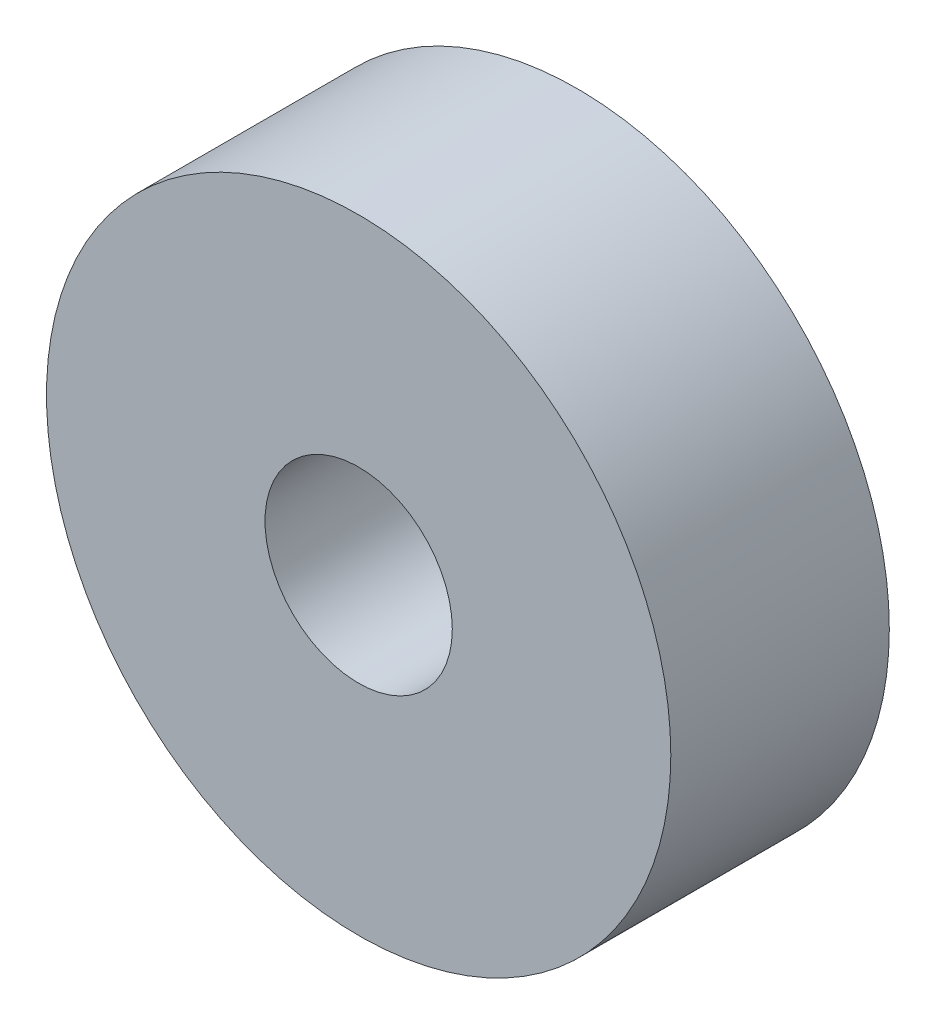
ISO-10303-21;
HEADER;
FILE_DESCRIPTION(('STEP AP214'),'2;1');
FILE_NAME('part.step','',(''),(''),'','','');
FILE_SCHEMA(('AUTOMOTIVE_DESIGN { 1 0 10303 214 1 1 1 1 }'));
ENDSEC;
DATA;
#1=APPLICATION_CONTEXT('core data for automotive mechanical design processes');
#2=APPLICATION_PROTOCOL_DEFINITION('international standard','automotive_design',2000,#1);
#3=PRODUCT_CONTEXT('',#1,'mechanical');
#4=PRODUCT('Part','Part','',(#3));
#5=PRODUCT_RELATED_PRODUCT_CATEGORY('part','',(#4));
#6=PRODUCT_DEFINITION_FORMATION('','',#4);
#7=PRODUCT_DEFINITION_CONTEXT('part definition',#1,'design');
#8=PRODUCT_DEFINITION('design','',#6,#7);
#9=PRODUCT_DEFINITION_SHAPE('','',#8);
#10=(LENGTH_UNIT() NAMED_UNIT(*) SI_UNIT(.MILLI.,.METRE.));
#11=(NAMED_UNIT(*) PLANE_ANGLE_UNIT() SI_UNIT($,.RADIAN.));
#12=(NAMED_UNIT(*) SI_UNIT($,.STERADIAN.) SOLID_ANGLE_UNIT());
#13=UNCERTAINTY_MEASURE_WITH_UNIT(LENGTH_MEASURE(1.E-05),#10,'distance_accuracy_value','');
#14=(GEOMETRIC_REPRESENTATION_CONTEXT(3) GLOBAL_UNCERTAINTY_ASSIGNED_CONTEXT((#13)) GLOBAL_UNIT_ASSIGNED_CONTEXT((#10,
#11,#12)) REPRESENTATION_CONTEXT('',''));
#15=CARTESIAN_POINT('',(0.,0.,0.));
#16=DIRECTION('',(0.,0.,1.));
#17=DIRECTION('',(1.,0.,0.));
#18=AXIS2_PLACEMENT_3D('',#15,#16,#17);
#19=CARTESIAN_POINT('',(-60.0680251972356,2.94451103908018,70.));
#20=DIRECTION('',(0.,0.,1.));
#21=DIRECTION('',(1.,0.,0.));
#22=AXIS2_PLACEMENT_3D('',#19,#20,#21);
#23=PLANE('',#22);
#24=CARTESIAN_POINT('',(-60.0680251972356,2.94451103908018,70.));
#25=DIRECTION('',(0.,0.,1.));
#26=DIRECTION('',(1.,0.,0.));
#27=AXIS2_PLACEMENT_3D('',#24,#25,#26);
#28=CIRCLE('',#27,100.);
#29=CARTESIAN_POINT('',(39.9319748027644,2.94451103908018,70.));
#30=VERTEX_POINT('',#29);
#31=EDGE_CURVE('E10',#30,#30,#28,.T.);
#32=ORIENTED_EDGE('',*,*,#31,.T.);
#33=EDGE_LOOP('',(#32));
#34=FACE_BOUND('',#33,.T.);
#35=CARTESIAN_POINT('',(-60.0680251972356,2.94451103908018,70.));
#36=DIRECTION('',(0.,0.,1.));
#37=DIRECTION('',(1.,0.,0.));
#38=AXIS2_PLACEMENT_3D('',#35,#36,#37);
#39=CIRCLE('',#38,30.);
#40=CARTESIAN_POINT('',(-30.0680251972356,2.94451103908018,70.));
#41=VERTEX_POINT('',#40);
#42=EDGE_CURVE('E42',#41,#41,#39,.T.);
#43=ORIENTED_EDGE('',*,*,#42,.F.);
#44=EDGE_LOOP('',(#43));
#45=FACE_BOUND('',#44,.T.);
#46=ADVANCED_FACE('F31',(#34,#45),#23,.T.);
#47=CARTESIAN_POINT('',(-60.0680251972356,2.94451103908018,0.));
#48=DIRECTION('',(0.,0.,1.));
#49=DIRECTION('',(1.,0.,0.));
#50=AXIS2_PLACEMENT_3D('',#47,#48,#49);
#51=PLANE('',#50);
#52=CARTESIAN_POINT('',(-60.0680251972356,2.94451103908018,0.));
#53=DIRECTION('',(0.,0.,1.));
#54=DIRECTION('',(1.,0.,0.));
#55=AXIS2_PLACEMENT_3D('',#52,#53,#54);
#56=CIRCLE('',#55,100.);
#57=CARTESIAN_POINT('',(39.9319748027644,2.94451103908018,0.));
#58=VERTEX_POINT('',#57);
#59=EDGE_CURVE('E35',#58,#58,#56,.T.);
#60=ORIENTED_EDGE('',*,*,#59,.F.);
#61=EDGE_LOOP('',(#60));
#62=FACE_BOUND('',#61,.T.);
#63=CARTESIAN_POINT('',(-60.0680251972356,2.94451103908018,0.));
#64=DIRECTION('',(0.,0.,1.));
#65=DIRECTION('',(1.,0.,0.));
#66=AXIS2_PLACEMENT_3D('',#63,#64,#65);
#67=CIRCLE('',#66,30.);
#68=CARTESIAN_POINT('',(-30.0680251972356,2.94451103908018,0.));
#69=VERTEX_POINT('',#68);
#70=EDGE_CURVE('E44',#69,#69,#67,.T.);
#71=ORIENTED_EDGE('',*,*,#70,.T.);
#72=EDGE_LOOP('',(#71));
#73=FACE_BOUND('',#72,.T.);
#74=ADVANCED_FACE('F54',(#62,#73),#51,.F.);
#75=CARTESIAN_POINT('',(-60.0680251972356,2.94451103908018,70.));
#76=DIRECTION('',(0.,0.,-1.));
#77=DIRECTION('',(-1.,0.,0.));
#78=AXIS2_PLACEMENT_3D('',#75,#76,#77);
#79=CYLINDRICAL_SURFACE('',#78,100.);
#80=ORIENTED_EDGE('',*,*,#31,.F.);
#81=EDGE_LOOP('',(#80));
#82=FACE_BOUND('',#81,.T.);
#83=ORIENTED_EDGE('',*,*,#59,.T.);
#84=EDGE_LOOP('',(#83));
#85=FACE_BOUND('',#84,.T.);
#86=ADVANCED_FACE('F33',(#82,#85),#79,.T.);
#87=CARTESIAN_POINT('',(-60.0680251972356,2.94451103908018,70.));
#88=DIRECTION('',(0.,0.,-1.));
#89=DIRECTION('',(-1.,0.,0.));
#90=AXIS2_PLACEMENT_3D('',#87,#88,#89);
#91=CYLINDRICAL_SURFACE('',#90,30.);
#92=ORIENTED_EDGE('',*,*,#42,.T.);
#93=EDGE_LOOP('',(#92));
#94=FACE_BOUND('',#93,.T.);
#95=ORIENTED_EDGE('',*,*,#70,.F.);
#96=EDGE_LOOP('',(#95));
#97=FACE_BOUND('',#96,.T.);
#98=ADVANCED_FACE('F50',(#94,#97),#91,.F.);
#99=CLOSED_SHELL('',(#46,#74,#86,#98));
#100=MANIFOLD_SOLID_BREP('B2',#99);
#101=ADVANCED_BREP_SHAPE_REPRESENTATION('',(#18,#100),#14);
#102=SHAPE_DEFINITION_REPRESENTATION(#9,#101);
ENDSEC;
END-ISO-10303-21;
